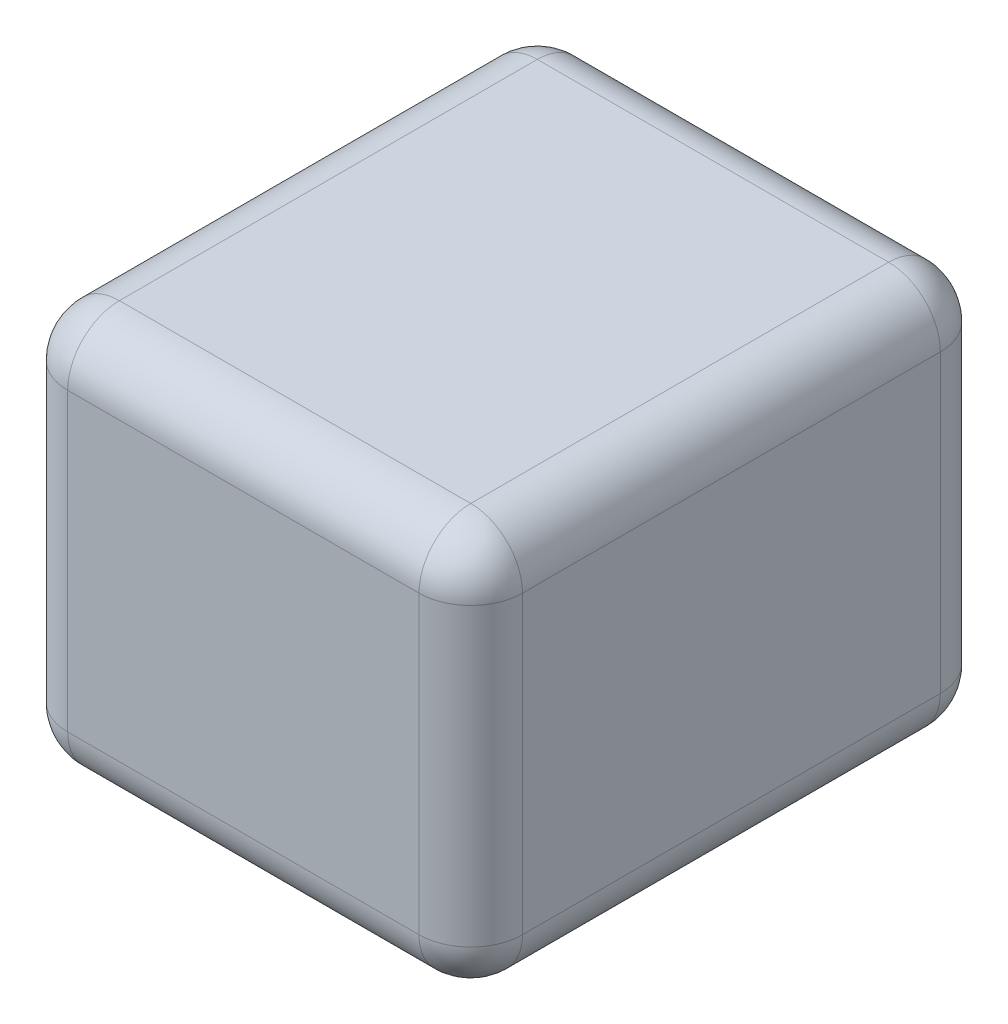
ISO-10303-21;
HEADER;
FILE_DESCRIPTION(('STEP AP214'),'2;1');
FILE_NAME('part.step','',(''),(''),'','','');
FILE_SCHEMA(('AUTOMOTIVE_DESIGN { 1 0 10303 214 1 1 1 1 }'));
ENDSEC;
DATA;
#1=APPLICATION_CONTEXT('core data for automotive mechanical design processes');
#2=APPLICATION_PROTOCOL_DEFINITION('international standard','automotive_design',2000,#1);
#3=PRODUCT_CONTEXT('',#1,'mechanical');
#4=PRODUCT('Part','Part','',(#3));
#5=PRODUCT_RELATED_PRODUCT_CATEGORY('part','',(#4));
#6=PRODUCT_DEFINITION_FORMATION('','',#4);
#7=PRODUCT_DEFINITION_CONTEXT('part definition',#1,'design');
#8=PRODUCT_DEFINITION('design','',#6,#7);
#9=PRODUCT_DEFINITION_SHAPE('','',#8);
#10=(LENGTH_UNIT() NAMED_UNIT(*) SI_UNIT(.MILLI.,.METRE.));
#11=(NAMED_UNIT(*) PLANE_ANGLE_UNIT() SI_UNIT($,.RADIAN.));
#12=(NAMED_UNIT(*) SI_UNIT($,.STERADIAN.) SOLID_ANGLE_UNIT());
#13=UNCERTAINTY_MEASURE_WITH_UNIT(LENGTH_MEASURE(1.E-05),#10,'distance_accuracy_value','');
#14=(GEOMETRIC_REPRESENTATION_CONTEXT(3) GLOBAL_UNCERTAINTY_ASSIGNED_CONTEXT((#13)) GLOBAL_UNIT_ASSIGNED_CONTEXT((#10,
#11,#12)) REPRESENTATION_CONTEXT('',''));
#15=CARTESIAN_POINT('',(0.,0.,0.));
#16=DIRECTION('',(0.,0.,1.));
#17=DIRECTION('',(1.,0.,0.));
#18=AXIS2_PLACEMENT_3D('',#15,#16,#17);
#19=CARTESIAN_POINT('',(23.75,20.,28.25));
#20=DIRECTION('',(0.,-1.,0.));
#21=DIRECTION('',(1.,0.,0.));
#22=AXIS2_PLACEMENT_3D('',#19,#20,#21);
#23=SPHERICAL_SURFACE('',#22,7.);
#24=CARTESIAN_POINT('',(23.75,20.,28.25));
#25=DIRECTION('',(0.,0.,-1.));
#26=DIRECTION('',(1.,0.,0.));
#27=AXIS2_PLACEMENT_3D('',#24,#25,#26);
#28=CIRCLE('',#27,7.);
#29=CARTESIAN_POINT('',(23.75,27.,28.25));
#30=VERTEX_POINT('',#29);
#31=CARTESIAN_POINT('',(30.75,20.,28.25));
#32=VERTEX_POINT('',#31);
#33=EDGE_CURVE('E10',#30,#32,#28,.T.);
#34=ORIENTED_EDGE('',*,*,#33,.F.);
#35=CARTESIAN_POINT('',(23.75,20.,28.25));
#36=DIRECTION('',(1.,0.,0.));
#37=DIRECTION('',(0.,0.,1.));
#38=AXIS2_PLACEMENT_3D('',#35,#36,#37);
#39=CIRCLE('',#38,7.);
#40=CARTESIAN_POINT('',(23.75,20.,35.25));
#41=VERTEX_POINT('',#40);
#42=EDGE_CURVE('E263',#30,#41,#39,.T.);
#43=ORIENTED_EDGE('',*,*,#42,.T.);
#44=CARTESIAN_POINT('',(23.75,20.,28.25));
#45=DIRECTION('',(0.,-1.,0.));
#46=DIRECTION('',(1.,0.,0.));
#47=AXIS2_PLACEMENT_3D('',#44,#45,#46);
#48=CIRCLE('',#47,7.);
#49=EDGE_CURVE('E267',#32,#41,#48,.T.);
#50=ORIENTED_EDGE('',*,*,#49,.F.);
#51=EDGE_LOOP('',(#34,#43,#50));
#52=FACE_BOUND('',#51,.T.);
#53=ADVANCED_FACE('F16',(#52),#23,.T.);
#54=CARTESIAN_POINT('',(23.75,20.,-28.25));
#55=DIRECTION('',(0.,0.,1.));
#56=DIRECTION('',(1.,0.,0.));
#57=AXIS2_PLACEMENT_3D('',#54,#55,#56);
#58=SPHERICAL_SURFACE('',#57,7.);
#59=CARTESIAN_POINT('',(23.75,20.,-28.25));
#60=DIRECTION('',(0.,-1.,0.));
#61=DIRECTION('',(1.,0.,0.));
#62=AXIS2_PLACEMENT_3D('',#59,#60,#61);
#63=CIRCLE('',#62,7.);
#64=CARTESIAN_POINT('',(23.75,20.,-35.25));
#65=VERTEX_POINT('',#64);
#66=CARTESIAN_POINT('',(30.75,20.,-28.25));
#67=VERTEX_POINT('',#66);
#68=EDGE_CURVE('E234',#65,#67,#63,.T.);
#69=ORIENTED_EDGE('',*,*,#68,.F.);
#70=CARTESIAN_POINT('',(23.75,20.,-28.25));
#71=DIRECTION('',(1.,0.,0.));
#72=DIRECTION('',(0.,1.,0.));
#73=AXIS2_PLACEMENT_3D('',#70,#71,#72);
#74=CIRCLE('',#73,7.);
#75=CARTESIAN_POINT('',(23.75,27.,-28.25));
#76=VERTEX_POINT('',#75);
#77=EDGE_CURVE('E152',#65,#76,#74,.T.);
#78=ORIENTED_EDGE('',*,*,#77,.T.);
#79=CARTESIAN_POINT('',(23.75,20.,-28.25));
#80=DIRECTION('',(0.,0.,1.));
#81=DIRECTION('',(1.,0.,0.));
#82=AXIS2_PLACEMENT_3D('',#79,#80,#81);
#83=CIRCLE('',#82,7.);
#84=EDGE_CURVE('E24',#67,#76,#83,.T.);
#85=ORIENTED_EDGE('',*,*,#84,.F.);
#86=EDGE_LOOP('',(#69,#78,#85));
#87=FACE_BOUND('',#86,.T.);
#88=ADVANCED_FACE('F279',(#87),#58,.T.);
#89=CARTESIAN_POINT('',(30.75,-27.,-35.25));
#90=DIRECTION('',(1.,0.,0.));
#91=DIRECTION('',(0.,1.,0.));
#92=AXIS2_PLACEMENT_3D('',#89,#90,#91);
#93=PLANE('',#92);
#94=DIRECTION('',(0.,0.,1.));
#95=VECTOR('',#94,1.);
#96=CARTESIAN_POINT('',(30.75,-20.,-35.25));
#97=LINE('',#96,#95);
#98=CARTESIAN_POINT('',(30.75,-20.,-28.25));
#99=VERTEX_POINT('',#98);
#100=CARTESIAN_POINT('',(30.75,-20.,28.25));
#101=VERTEX_POINT('',#100);
#102=EDGE_CURVE('E250',#99,#101,#97,.T.);
#103=ORIENTED_EDGE('',*,*,#102,.F.);
#104=DIRECTION('',(0.,1.,0.));
#105=VECTOR('',#104,1.);
#106=CARTESIAN_POINT('',(30.75,-27.,-28.25));
#107=LINE('',#106,#105);
#108=EDGE_CURVE('E259',#99,#67,#107,.T.);
#109=ORIENTED_EDGE('',*,*,#108,.T.);
#110=DIRECTION('',(0.,0.,1.));
#111=VECTOR('',#110,1.);
#112=CARTESIAN_POINT('',(30.75,20.,-35.25));
#113=LINE('',#112,#111);
#114=EDGE_CURVE('E273',#67,#32,#113,.T.);
#115=ORIENTED_EDGE('',*,*,#114,.T.);
#116=DIRECTION('',(0.,1.,0.));
#117=VECTOR('',#116,1.);
#118=CARTESIAN_POINT('',(30.75,-27.,28.25));
#119=LINE('',#118,#117);
#120=EDGE_CURVE('E185',#101,#32,#119,.T.);
#121=ORIENTED_EDGE('',*,*,#120,.F.);
#122=EDGE_LOOP('',(#103,#109,#115,#121));
#123=FACE_BOUND('',#122,.T.);
#124=ADVANCED_FACE('F381',(#123),#93,.T.);
#125=CARTESIAN_POINT('',(23.75,-20.,28.25));
#126=DIRECTION('',(0.,0.,-1.));
#127=DIRECTION('',(1.,0.,0.));
#128=AXIS2_PLACEMENT_3D('',#125,#126,#127);
#129=SPHERICAL_SURFACE('',#128,7.);
#130=CARTESIAN_POINT('',(23.75,-20.,28.25));
#131=DIRECTION('',(0.,1.,0.));
#132=DIRECTION('',(1.,0.,0.));
#133=AXIS2_PLACEMENT_3D('',#130,#131,#132);
#134=CIRCLE('',#133,7.);
#135=CARTESIAN_POINT('',(23.75,-20.,35.25));
#136=VERTEX_POINT('',#135);
#137=EDGE_CURVE('E270',#136,#101,#134,.T.);
#138=ORIENTED_EDGE('',*,*,#137,.F.);
#139=CARTESIAN_POINT('',(23.75,-20.,28.25));
#140=DIRECTION('',(1.,0.,0.));
#141=DIRECTION('',(0.,-1.,0.));
#142=AXIS2_PLACEMENT_3D('',#139,#140,#141);
#143=CIRCLE('',#142,7.);
#144=CARTESIAN_POINT('',(23.75,-27.,28.25));
#145=VERTEX_POINT('',#144);
#146=EDGE_CURVE('E242',#136,#145,#143,.T.);
#147=ORIENTED_EDGE('',*,*,#146,.T.);
#148=CARTESIAN_POINT('',(23.75,-20.,28.25));
#149=DIRECTION('',(0.,0.,-1.));
#150=DIRECTION('',(1.,0.,0.));
#151=AXIS2_PLACEMENT_3D('',#148,#149,#150);
#152=CIRCLE('',#151,7.);
#153=EDGE_CURVE('E246',#101,#145,#152,.T.);
#154=ORIENTED_EDGE('',*,*,#153,.F.);
#155=EDGE_LOOP('',(#138,#147,#154));
#156=FACE_BOUND('',#155,.T.);
#157=ADVANCED_FACE('F397',(#156),#129,.T.);
#158=CARTESIAN_POINT('',(23.75,-20.,-28.25));
#159=DIRECTION('',(0.,0.,1.));
#160=DIRECTION('',(1.,0.,0.));
#161=AXIS2_PLACEMENT_3D('',#158,#159,#160);
#162=SPHERICAL_SURFACE('',#161,7.);
#163=CARTESIAN_POINT('',(23.75,-20.,-28.25));
#164=DIRECTION('',(0.,0.,-1.));
#165=DIRECTION('',(1.,0.,0.));
#166=AXIS2_PLACEMENT_3D('',#163,#164,#165);
#167=CIRCLE('',#166,7.);
#168=CARTESIAN_POINT('',(23.75,-27.,-28.25));
#169=VERTEX_POINT('',#168);
#170=EDGE_CURVE('E247',#99,#169,#167,.T.);
#171=ORIENTED_EDGE('',*,*,#170,.T.);
#172=CARTESIAN_POINT('',(23.75,-20.,-28.25));
#173=DIRECTION('',(-1.,0.,0.));
#174=DIRECTION('',(0.,-1.,0.));
#175=AXIS2_PLACEMENT_3D('',#172,#173,#174);
#176=CIRCLE('',#175,7.);
#177=CARTESIAN_POINT('',(23.75,-20.,-35.25));
#178=VERTEX_POINT('',#177);
#179=EDGE_CURVE('E238',#178,#169,#176,.T.);
#180=ORIENTED_EDGE('',*,*,#179,.F.);
#181=CARTESIAN_POINT('',(23.75,-20.,-28.25));
#182=DIRECTION('',(0.,-1.,0.));
#183=DIRECTION('',(1.,0.,0.));
#184=AXIS2_PLACEMENT_3D('',#181,#182,#183);
#185=CIRCLE('',#184,7.);
#186=EDGE_CURVE('E230',#178,#99,#185,.T.);
#187=ORIENTED_EDGE('',*,*,#186,.T.);
#188=EDGE_LOOP('',(#171,#180,#187));
#189=FACE_BOUND('',#188,.T.);
#190=ADVANCED_FACE('F408',(#189),#162,.T.);
#191=CARTESIAN_POINT('',(23.75,20.,-35.25));
#192=DIRECTION('',(0.,0.,1.));
#193=DIRECTION('',(1.,0.,0.));
#194=AXIS2_PLACEMENT_3D('',#191,#192,#193);
#195=CYLINDRICAL_SURFACE('',#194,7.);
#196=ORIENTED_EDGE('',*,*,#114,.F.);
#197=ORIENTED_EDGE('',*,*,#84,.T.);
#198=DIRECTION('',(0.,0.,1.));
#199=VECTOR('',#198,1.);
#200=CARTESIAN_POINT('',(23.75,27.,-35.25));
#201=LINE('',#200,#199);
#202=EDGE_CURVE('E229',#76,#30,#201,.T.);
#203=ORIENTED_EDGE('',*,*,#202,.T.);
#204=ORIENTED_EDGE('',*,*,#33,.T.);
#205=EDGE_LOOP('',(#196,#197,#203,#204));
#206=FACE_BOUND('',#205,.T.);
#207=ADVANCED_FACE('F277',(#206),#195,.T.);
#208=CARTESIAN_POINT('',(23.75,-27.,28.25));
#209=DIRECTION('',(0.,1.,0.));
#210=DIRECTION('',(1.,0.,0.));
#211=AXIS2_PLACEMENT_3D('',#208,#209,#210);
#212=CYLINDRICAL_SURFACE('',#211,7.);
#213=ORIENTED_EDGE('',*,*,#120,.T.);
#214=ORIENTED_EDGE('',*,*,#49,.T.);
#215=DIRECTION('',(0.,1.,0.));
#216=VECTOR('',#215,1.);
#217=CARTESIAN_POINT('',(23.75,-27.,35.25));
#218=LINE('',#217,#216);
#219=EDGE_CURVE('E214',#136,#41,#218,.T.);
#220=ORIENTED_EDGE('',*,*,#219,.F.);
#221=ORIENTED_EDGE('',*,*,#137,.T.);
#222=EDGE_LOOP('',(#213,#214,#220,#221));
#223=FACE_BOUND('',#222,.T.);
#224=ADVANCED_FACE('F387',(#223),#212,.T.);
#225=CARTESIAN_POINT('',(-30.75,20.,28.25));
#226=DIRECTION('',(1.,0.,0.));
#227=DIRECTION('',(0.,1.,0.));
#228=AXIS2_PLACEMENT_3D('',#225,#226,#227);
#229=CYLINDRICAL_SURFACE('',#228,7.);
#230=CARTESIAN_POINT('',(-23.75,20.,28.25));
#231=DIRECTION('',(1.,0.,0.));
#232=DIRECTION('',(0.,0.,1.));
#233=AXIS2_PLACEMENT_3D('',#230,#231,#232);
#234=CIRCLE('',#233,7.);
#235=CARTESIAN_POINT('',(-23.75,27.,28.25));
#236=VERTEX_POINT('',#235);
#237=CARTESIAN_POINT('',(-23.75,20.,35.25));
#238=VERTEX_POINT('',#237);
#239=EDGE_CURVE('E222',#236,#238,#234,.T.);
#240=ORIENTED_EDGE('',*,*,#239,.T.);
#241=DIRECTION('',(1.,0.,0.));
#242=VECTOR('',#241,1.);
#243=CARTESIAN_POINT('',(-30.75,20.,35.25));
#244=LINE('',#243,#242);
#245=EDGE_CURVE('E218',#238,#41,#244,.T.);
#246=ORIENTED_EDGE('',*,*,#245,.T.);
#247=ORIENTED_EDGE('',*,*,#42,.F.);
#248=DIRECTION('',(1.,0.,0.));
#249=VECTOR('',#248,1.);
#250=CARTESIAN_POINT('',(-30.75,27.,28.25));
#251=LINE('',#250,#249);
#252=EDGE_CURVE('E225',#236,#30,#251,.T.);
#253=ORIENTED_EDGE('',*,*,#252,.F.);
#254=EDGE_LOOP('',(#240,#246,#247,#253));
#255=FACE_BOUND('',#254,.T.);
#256=ADVANCED_FACE('F289',(#255),#229,.T.);
#257=CARTESIAN_POINT('',(23.75,-27.,-28.25));
#258=DIRECTION('',(0.,1.,0.));
#259=DIRECTION('',(1.,0.,0.));
#260=AXIS2_PLACEMENT_3D('',#257,#258,#259);
#261=CYLINDRICAL_SURFACE('',#260,7.);
#262=ORIENTED_EDGE('',*,*,#186,.F.);
#263=DIRECTION('',(0.,1.,0.));
#264=VECTOR('',#263,1.);
#265=CARTESIAN_POINT('',(23.75,-27.,-35.25));
#266=LINE('',#265,#264);
#267=EDGE_CURVE('E157',#178,#65,#266,.T.);
#268=ORIENTED_EDGE('',*,*,#267,.T.);
#269=ORIENTED_EDGE('',*,*,#68,.T.);
#270=ORIENTED_EDGE('',*,*,#108,.F.);
#271=EDGE_LOOP('',(#262,#268,#269,#270));
#272=FACE_BOUND('',#271,.T.);
#273=ADVANCED_FACE('F410',(#272),#261,.T.);
#274=CARTESIAN_POINT('',(-30.75,20.,-28.25));
#275=DIRECTION('',(1.,0.,0.));
#276=DIRECTION('',(0.,1.,0.));
#277=AXIS2_PLACEMENT_3D('',#274,#275,#276);
#278=CYLINDRICAL_SURFACE('',#277,7.);
#279=DIRECTION('',(1.,0.,0.));
#280=VECTOR('',#279,1.);
#281=CARTESIAN_POINT('',(-30.75,27.,-28.25));
#282=LINE('',#281,#280);
#283=CARTESIAN_POINT('',(-23.75,27.,-28.25));
#284=VERTEX_POINT('',#283);
#285=EDGE_CURVE('E237',#284,#76,#282,.T.);
#286=ORIENTED_EDGE('',*,*,#285,.T.);
#287=ORIENTED_EDGE('',*,*,#77,.F.);
#288=DIRECTION('',(1.,0.,0.));
#289=VECTOR('',#288,1.);
#290=CARTESIAN_POINT('',(-30.75,20.,-35.25));
#291=LINE('',#290,#289);
#292=CARTESIAN_POINT('',(-23.75,20.,-35.25));
#293=VERTEX_POINT('',#292);
#294=EDGE_CURVE('E149',#293,#65,#291,.T.);
#295=ORIENTED_EDGE('',*,*,#294,.F.);
#296=CARTESIAN_POINT('',(-23.75,20.,-28.25));
#297=DIRECTION('',(1.,0.,0.));
#298=DIRECTION('',(0.,1.,0.));
#299=AXIS2_PLACEMENT_3D('',#296,#297,#298);
#300=CIRCLE('',#299,7.);
#301=EDGE_CURVE('E133',#293,#284,#300,.T.);
#302=ORIENTED_EDGE('',*,*,#301,.T.);
#303=EDGE_LOOP('',(#286,#287,#295,#302));
#304=FACE_BOUND('',#303,.T.);
#305=ADVANCED_FACE('F151',(#304),#278,.T.);
#306=CARTESIAN_POINT('',(23.75,-20.,-35.25));
#307=DIRECTION('',(0.,0.,1.));
#308=DIRECTION('',(1.,0.,0.));
#309=AXIS2_PLACEMENT_3D('',#306,#307,#308);
#310=CYLINDRICAL_SURFACE('',#309,7.);
#311=ORIENTED_EDGE('',*,*,#153,.T.);
#312=DIRECTION('',(0.,0.,1.));
#313=VECTOR('',#312,1.);
#314=CARTESIAN_POINT('',(23.75,-27.,-35.25));
#315=LINE('',#314,#313);
#316=EDGE_CURVE('E205',#169,#145,#315,.T.);
#317=ORIENTED_EDGE('',*,*,#316,.F.);
#318=ORIENTED_EDGE('',*,*,#170,.F.);
#319=ORIENTED_EDGE('',*,*,#102,.T.);
#320=EDGE_LOOP('',(#311,#317,#318,#319));
#321=FACE_BOUND('',#320,.T.);
#322=ADVANCED_FACE('F394',(#321),#310,.T.);
#323=CARTESIAN_POINT('',(-30.75,-20.,28.25));
#324=DIRECTION('',(1.,0.,0.));
#325=DIRECTION('',(0.,-1.,0.));
#326=AXIS2_PLACEMENT_3D('',#323,#324,#325);
#327=CYLINDRICAL_SURFACE('',#326,7.);
#328=DIRECTION('',(1.,0.,0.));
#329=VECTOR('',#328,1.);
#330=CARTESIAN_POINT('',(-30.75,-27.,28.25));
#331=LINE('',#330,#329);
#332=CARTESIAN_POINT('',(-23.75,-27.,28.25));
#333=VERTEX_POINT('',#332);
#334=EDGE_CURVE('E158',#333,#145,#331,.T.);
#335=ORIENTED_EDGE('',*,*,#334,.T.);
#336=ORIENTED_EDGE('',*,*,#146,.F.);
#337=DIRECTION('',(1.,0.,0.));
#338=VECTOR('',#337,1.);
#339=CARTESIAN_POINT('',(-30.75,-20.,35.25));
#340=LINE('',#339,#338);
#341=CARTESIAN_POINT('',(-23.75,-20.,35.25));
#342=VERTEX_POINT('',#341);
#343=EDGE_CURVE('E144',#342,#136,#340,.T.);
#344=ORIENTED_EDGE('',*,*,#343,.F.);
#345=CARTESIAN_POINT('',(-23.75,-20.,28.25));
#346=DIRECTION('',(1.,0.,0.));
#347=DIRECTION('',(0.,-1.,0.));
#348=AXIS2_PLACEMENT_3D('',#345,#346,#347);
#349=CIRCLE('',#348,7.);
#350=EDGE_CURVE('E197',#342,#333,#349,.T.);
#351=ORIENTED_EDGE('',*,*,#350,.T.);
#352=EDGE_LOOP('',(#335,#336,#344,#351));
#353=FACE_BOUND('',#352,.T.);
#354=ADVANCED_FACE('F400',(#353),#327,.T.);
#355=CARTESIAN_POINT('',(-30.75,-20.,-28.25));
#356=DIRECTION('',(1.,0.,0.));
#357=DIRECTION('',(0.,-1.,0.));
#358=AXIS2_PLACEMENT_3D('',#355,#356,#357);
#359=CYLINDRICAL_SURFACE('',#358,7.);
#360=CARTESIAN_POINT('',(-23.75,-20.,-28.25));
#361=DIRECTION('',(-1.,0.,0.));
#362=DIRECTION('',(0.,-1.,0.));
#363=AXIS2_PLACEMENT_3D('',#360,#361,#362);
#364=CIRCLE('',#363,7.);
#365=CARTESIAN_POINT('',(-23.75,-20.,-35.25));
#366=VERTEX_POINT('',#365);
#367=CARTESIAN_POINT('',(-23.75,-27.,-28.25));
#368=VERTEX_POINT('',#367);
#369=EDGE_CURVE('E193',#366,#368,#364,.T.);
#370=ORIENTED_EDGE('',*,*,#369,.F.);
#371=DIRECTION('',(1.,0.,0.));
#372=VECTOR('',#371,1.);
#373=CARTESIAN_POINT('',(-30.75,-20.,-35.25));
#374=LINE('',#373,#372);
#375=EDGE_CURVE('E145',#366,#178,#374,.T.);
#376=ORIENTED_EDGE('',*,*,#375,.T.);
#377=ORIENTED_EDGE('',*,*,#179,.T.);
#378=DIRECTION('',(1.,0.,0.));
#379=VECTOR('',#378,1.);
#380=CARTESIAN_POINT('',(-30.75,-27.,-28.25));
#381=LINE('',#380,#379);
#382=EDGE_CURVE('E201',#368,#169,#381,.T.);
#383=ORIENTED_EDGE('',*,*,#382,.F.);
#384=EDGE_LOOP('',(#370,#376,#377,#383));
#385=FACE_BOUND('',#384,.T.);
#386=ADVANCED_FACE('F405',(#385),#359,.T.);
#387=CARTESIAN_POINT('',(-30.75,27.,-35.25));
#388=DIRECTION('',(0.,1.,0.));
#389=DIRECTION('',(1.,0.,0.));
#390=AXIS2_PLACEMENT_3D('',#387,#388,#389);
#391=PLANE('',#390);
#392=DIRECTION('',(0.,0.,1.));
#393=VECTOR('',#392,1.);
#394=CARTESIAN_POINT('',(-23.75,27.,-35.25));
#395=LINE('',#394,#393);
#396=EDGE_CURVE('E191',#284,#236,#395,.T.);
#397=ORIENTED_EDGE('',*,*,#396,.T.);
#398=ORIENTED_EDGE('',*,*,#252,.T.);
#399=ORIENTED_EDGE('',*,*,#202,.F.);
#400=ORIENTED_EDGE('',*,*,#285,.F.);
#401=EDGE_LOOP('',(#397,#398,#399,#400));
#402=FACE_BOUND('',#401,.T.);
#403=ADVANCED_FACE('F284',(#402),#391,.T.);
#404=CARTESIAN_POINT('',(-23.75,20.,28.25));
#405=DIRECTION('',(0.,-1.,0.));
#406=DIRECTION('',(-1.,0.,0.));
#407=AXIS2_PLACEMENT_3D('',#404,#405,#406);
#408=SPHERICAL_SURFACE('',#407,7.);
#409=CARTESIAN_POINT('',(-23.75,20.,28.25));
#410=DIRECTION('',(0.,1.,0.));
#411=DIRECTION('',(-1.,0.,0.));
#412=AXIS2_PLACEMENT_3D('',#409,#410,#411);
#413=CIRCLE('',#412,7.);
#414=CARTESIAN_POINT('',(-30.75,20.,28.25));
#415=VERTEX_POINT('',#414);
#416=EDGE_CURVE('E192',#415,#238,#413,.T.);
#417=ORIENTED_EDGE('',*,*,#416,.T.);
#418=ORIENTED_EDGE('',*,*,#239,.F.);
#419=CARTESIAN_POINT('',(-23.75,20.,28.25));
#420=DIRECTION('',(0.,0.,1.));
#421=DIRECTION('',(-1.,0.,0.));
#422=AXIS2_PLACEMENT_3D('',#419,#420,#421);
#423=CIRCLE('',#422,7.);
#424=EDGE_CURVE('E188',#236,#415,#423,.T.);
#425=ORIENTED_EDGE('',*,*,#424,.T.);
#426=EDGE_LOOP('',(#417,#418,#425));
#427=FACE_BOUND('',#426,.T.);
#428=ADVANCED_FACE('F293',(#427),#408,.T.);
#429=CARTESIAN_POINT('',(-30.75,-27.,35.25));
#430=DIRECTION('',(0.,0.,1.));
#431=DIRECTION('',(1.,0.,0.));
#432=AXIS2_PLACEMENT_3D('',#429,#430,#431);
#433=PLANE('',#432);
#434=DIRECTION('',(0.,1.,0.));
#435=VECTOR('',#434,1.);
#436=CARTESIAN_POINT('',(-23.75,-27.,35.25));
#437=LINE('',#436,#435);
#438=EDGE_CURVE('E300',#342,#238,#437,.T.);
#439=ORIENTED_EDGE('',*,*,#438,.F.);
#440=ORIENTED_EDGE('',*,*,#343,.T.);
#441=ORIENTED_EDGE('',*,*,#219,.T.);
#442=ORIENTED_EDGE('',*,*,#245,.F.);
#443=EDGE_LOOP('',(#439,#440,#441,#442));
#444=FACE_BOUND('',#443,.T.);
#445=ADVANCED_FACE('F518',(#444),#433,.T.);
#446=CARTESIAN_POINT('',(-23.75,20.,-28.25));
#447=DIRECTION('',(0.,0.,1.));
#448=DIRECTION('',(-1.,0.,0.));
#449=AXIS2_PLACEMENT_3D('',#446,#447,#448);
#450=SPHERICAL_SURFACE('',#449,7.);
#451=CARTESIAN_POINT('',(-23.75,20.,-28.25));
#452=DIRECTION('',(0.,0.,-1.));
#453=DIRECTION('',(-1.,0.,0.));
#454=AXIS2_PLACEMENT_3D('',#451,#452,#453);
#455=CIRCLE('',#454,7.);
#456=CARTESIAN_POINT('',(-30.75,20.,-28.25));
#457=VERTEX_POINT('',#456);
#458=EDGE_CURVE('E139',#457,#284,#455,.T.);
#459=ORIENTED_EDGE('',*,*,#458,.T.);
#460=ORIENTED_EDGE('',*,*,#301,.F.);
#461=CARTESIAN_POINT('',(-23.75,20.,-28.25));
#462=DIRECTION('',(0.,1.,0.));
#463=DIRECTION('',(-1.,0.,0.));
#464=AXIS2_PLACEMENT_3D('',#461,#462,#463);
#465=CIRCLE('',#464,7.);
#466=EDGE_CURVE('E137',#293,#457,#465,.T.);
#467=ORIENTED_EDGE('',*,*,#466,.T.);
#468=EDGE_LOOP('',(#459,#460,#467));
#469=FACE_BOUND('',#468,.T.);
#470=ADVANCED_FACE('F135',(#469),#450,.T.);
#471=CARTESIAN_POINT('',(-30.75,-27.,-35.25));
#472=DIRECTION('',(0.,0.,1.));
#473=DIRECTION('',(1.,0.,0.));
#474=AXIS2_PLACEMENT_3D('',#471,#472,#473);
#475=PLANE('',#474);
#476=ORIENTED_EDGE('',*,*,#294,.T.);
#477=ORIENTED_EDGE('',*,*,#267,.F.);
#478=ORIENTED_EDGE('',*,*,#375,.F.);
#479=DIRECTION('',(0.,1.,0.));
#480=VECTOR('',#479,1.);
#481=CARTESIAN_POINT('',(-23.75,-27.,-35.25));
#482=LINE('',#481,#480);
#483=EDGE_CURVE('E161',#366,#293,#482,.T.);
#484=ORIENTED_EDGE('',*,*,#483,.T.);
#485=EDGE_LOOP('',(#476,#477,#478,#484));
#486=FACE_BOUND('',#485,.T.);
#487=ADVANCED_FACE('F162',(#486),#475,.F.);
#488=CARTESIAN_POINT('',(-30.75,-27.,-35.25));
#489=DIRECTION('',(0.,1.,0.));
#490=DIRECTION('',(1.,0.,0.));
#491=AXIS2_PLACEMENT_3D('',#488,#489,#490);
#492=PLANE('',#491);
#493=ORIENTED_EDGE('',*,*,#382,.T.);
#494=ORIENTED_EDGE('',*,*,#316,.T.);
#495=ORIENTED_EDGE('',*,*,#334,.F.);
#496=DIRECTION('',(0.,0.,1.));
#497=VECTOR('',#496,1.);
#498=CARTESIAN_POINT('',(-23.75,-27.,-35.25));
#499=LINE('',#498,#497);
#500=EDGE_CURVE('E181',#368,#333,#499,.T.);
#501=ORIENTED_EDGE('',*,*,#500,.F.);
#502=EDGE_LOOP('',(#493,#494,#495,#501));
#503=FACE_BOUND('',#502,.T.);
#504=ADVANCED_FACE('F403',(#503),#492,.F.);
#505=CARTESIAN_POINT('',(-23.75,-20.,28.25));
#506=DIRECTION('',(0.,0.,-1.));
#507=DIRECTION('',(-1.,0.,0.));
#508=AXIS2_PLACEMENT_3D('',#505,#506,#507);
#509=SPHERICAL_SURFACE('',#508,7.);
#510=CARTESIAN_POINT('',(-23.75,-20.,28.25));
#511=DIRECTION('',(0.,0.,1.));
#512=DIRECTION('',(-1.,0.,0.));
#513=AXIS2_PLACEMENT_3D('',#510,#511,#512);
#514=CIRCLE('',#513,7.);
#515=CARTESIAN_POINT('',(-30.75,-20.,28.25));
#516=VERTEX_POINT('',#515);
#517=EDGE_CURVE('E174',#516,#333,#514,.T.);
#518=ORIENTED_EDGE('',*,*,#517,.T.);
#519=ORIENTED_EDGE('',*,*,#350,.F.);
#520=CARTESIAN_POINT('',(-23.75,-20.,28.25));
#521=DIRECTION('',(0.,-1.,0.));
#522=DIRECTION('',(-1.,0.,0.));
#523=AXIS2_PLACEMENT_3D('',#520,#521,#522);
#524=CIRCLE('',#523,7.);
#525=EDGE_CURVE('E305',#342,#516,#524,.T.);
#526=ORIENTED_EDGE('',*,*,#525,.T.);
#527=EDGE_LOOP('',(#518,#519,#526));
#528=FACE_BOUND('',#527,.T.);
#529=ADVANCED_FACE('F372',(#528),#509,.T.);
#530=CARTESIAN_POINT('',(-23.75,-20.,-28.25));
#531=DIRECTION('',(0.,0.,1.));
#532=DIRECTION('',(-1.,0.,0.));
#533=AXIS2_PLACEMENT_3D('',#530,#531,#532);
#534=SPHERICAL_SURFACE('',#533,7.);
#535=CARTESIAN_POINT('',(-23.75,-20.,-28.25));
#536=DIRECTION('',(0.,1.,0.));
#537=DIRECTION('',(-1.,0.,0.));
#538=AXIS2_PLACEMENT_3D('',#535,#536,#537);
#539=CIRCLE('',#538,7.);
#540=CARTESIAN_POINT('',(-30.75,-20.,-28.25));
#541=VERTEX_POINT('',#540);
#542=EDGE_CURVE('E167',#366,#541,#539,.T.);
#543=ORIENTED_EDGE('',*,*,#542,.F.);
#544=ORIENTED_EDGE('',*,*,#369,.T.);
#545=CARTESIAN_POINT('',(-23.75,-20.,-28.25));
#546=DIRECTION('',(0.,0.,1.));
#547=DIRECTION('',(-1.,0.,0.));
#548=AXIS2_PLACEMENT_3D('',#545,#546,#547);
#549=CIRCLE('',#548,7.);
#550=EDGE_CURVE('E321',#541,#368,#549,.T.);
#551=ORIENTED_EDGE('',*,*,#550,.F.);
#552=EDGE_LOOP('',(#543,#544,#551));
#553=FACE_BOUND('',#552,.T.);
#554=ADVANCED_FACE('F339',(#553),#534,.T.);
#555=CARTESIAN_POINT('',(-23.75,20.,-35.25));
#556=DIRECTION('',(0.,0.,1.));
#557=DIRECTION('',(-1.,0.,0.));
#558=AXIS2_PLACEMENT_3D('',#555,#556,#557);
#559=CYLINDRICAL_SURFACE('',#558,7.);
#560=ORIENTED_EDGE('',*,*,#424,.F.);
#561=ORIENTED_EDGE('',*,*,#396,.F.);
#562=ORIENTED_EDGE('',*,*,#458,.F.);
#563=DIRECTION('',(0.,0.,1.));
#564=VECTOR('',#563,1.);
#565=CARTESIAN_POINT('',(-30.75,20.,-35.25));
#566=LINE('',#565,#564);
#567=EDGE_CURVE('E347',#457,#415,#566,.T.);
#568=ORIENTED_EDGE('',*,*,#567,.T.);
#569=EDGE_LOOP('',(#560,#561,#562,#568));
#570=FACE_BOUND('',#569,.T.);
#571=ADVANCED_FACE('F363',(#570),#559,.T.);
#572=CARTESIAN_POINT('',(-23.75,-27.,28.25));
#573=DIRECTION('',(0.,1.,0.));
#574=DIRECTION('',(-1.,0.,0.));
#575=AXIS2_PLACEMENT_3D('',#572,#573,#574);
#576=CYLINDRICAL_SURFACE('',#575,7.);
#577=ORIENTED_EDGE('',*,*,#525,.F.);
#578=ORIENTED_EDGE('',*,*,#438,.T.);
#579=ORIENTED_EDGE('',*,*,#416,.F.);
#580=DIRECTION('',(0.,1.,0.));
#581=VECTOR('',#580,1.);
#582=CARTESIAN_POINT('',(-30.75,-27.,28.25));
#583=LINE('',#582,#581);
#584=EDGE_CURVE('E351',#516,#415,#583,.T.);
#585=ORIENTED_EDGE('',*,*,#584,.F.);
#586=EDGE_LOOP('',(#577,#578,#579,#585));
#587=FACE_BOUND('',#586,.T.);
#588=ADVANCED_FACE('F304',(#587),#576,.T.);
#589=CARTESIAN_POINT('',(-23.75,-27.,-28.25));
#590=DIRECTION('',(0.,1.,0.));
#591=DIRECTION('',(-1.,0.,0.));
#592=AXIS2_PLACEMENT_3D('',#589,#590,#591);
#593=CYLINDRICAL_SURFACE('',#592,7.);
#594=DIRECTION('',(0.,1.,0.));
#595=VECTOR('',#594,1.);
#596=CARTESIAN_POINT('',(-30.75,-27.,-28.25));
#597=LINE('',#596,#595);
#598=EDGE_CURVE('E171',#541,#457,#597,.T.);
#599=ORIENTED_EDGE('',*,*,#598,.T.);
#600=ORIENTED_EDGE('',*,*,#466,.F.);
#601=ORIENTED_EDGE('',*,*,#483,.F.);
#602=ORIENTED_EDGE('',*,*,#542,.T.);
#603=EDGE_LOOP('',(#599,#600,#601,#602));
#604=FACE_BOUND('',#603,.T.);
#605=ADVANCED_FACE('F169',(#604),#593,.T.);
#606=CARTESIAN_POINT('',(-23.75,-20.,-35.25));
#607=DIRECTION('',(0.,0.,1.));
#608=DIRECTION('',(-1.,0.,0.));
#609=AXIS2_PLACEMENT_3D('',#606,#607,#608);
#610=CYLINDRICAL_SURFACE('',#609,7.);
#611=DIRECTION('',(0.,0.,1.));
#612=VECTOR('',#611,1.);
#613=CARTESIAN_POINT('',(-30.75,-20.,-35.25));
#614=LINE('',#613,#612);
#615=EDGE_CURVE('E318',#541,#516,#614,.T.);
#616=ORIENTED_EDGE('',*,*,#615,.F.);
#617=ORIENTED_EDGE('',*,*,#550,.T.);
#618=ORIENTED_EDGE('',*,*,#500,.T.);
#619=ORIENTED_EDGE('',*,*,#517,.F.);
#620=EDGE_LOOP('',(#616,#617,#618,#619));
#621=FACE_BOUND('',#620,.T.);
#622=ADVANCED_FACE('F343',(#621),#610,.T.);
#623=CARTESIAN_POINT('',(-30.75,-27.,-35.25));
#624=DIRECTION('',(1.,0.,0.));
#625=DIRECTION('',(0.,1.,0.));
#626=AXIS2_PLACEMENT_3D('',#623,#624,#625);
#627=PLANE('',#626);
#628=ORIENTED_EDGE('',*,*,#584,.T.);
#629=ORIENTED_EDGE('',*,*,#567,.F.);
#630=ORIENTED_EDGE('',*,*,#598,.F.);
#631=ORIENTED_EDGE('',*,*,#615,.T.);
#632=EDGE_LOOP('',(#628,#629,#630,#631));
#633=FACE_BOUND('',#632,.T.);
#634=ADVANCED_FACE('F346',(#633),#627,.F.);
#635=CLOSED_SHELL('',(#53,#88,#124,#157,#190,#207,#224,#256,#273,#305,#322,#354,#386,#403,#428,
#445,#470,#487,#504,#529,#554,#571,#588,#605,#622,#634));
#636=MANIFOLD_SOLID_BREP('B1',#635);
#637=ADVANCED_BREP_SHAPE_REPRESENTATION('',(#18,#636),#14);
#638=SHAPE_DEFINITION_REPRESENTATION(#9,#637);
ENDSEC;
END-ISO-10303-21;
